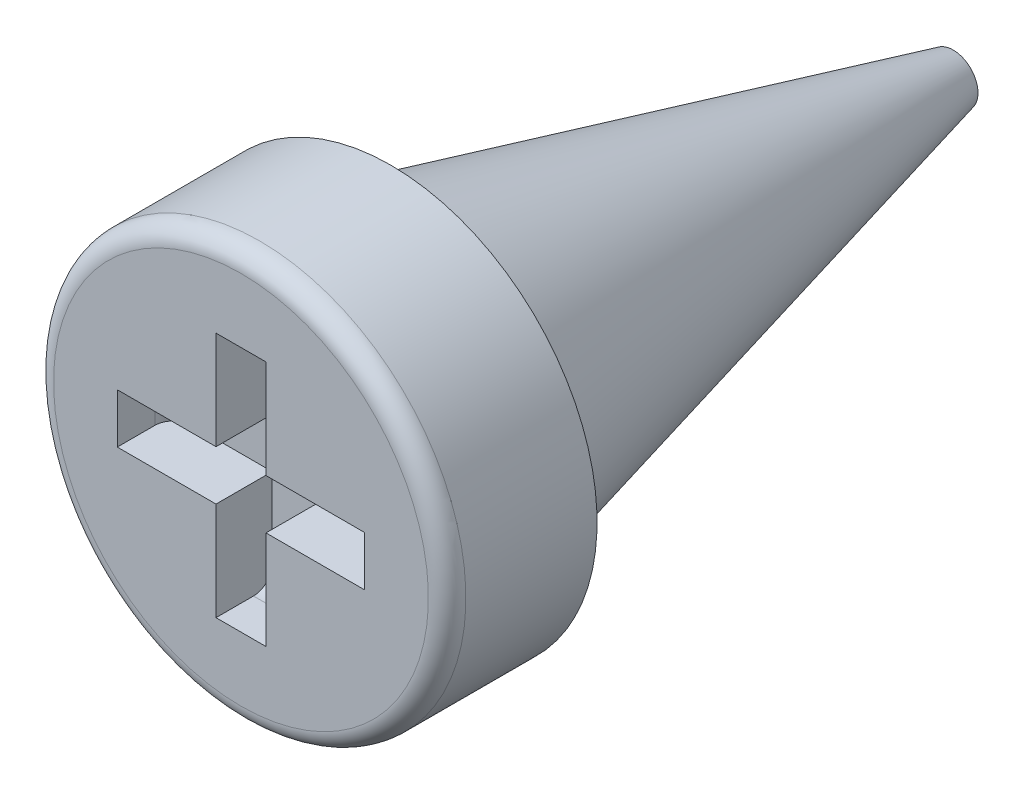
ISO-10303-21;
HEADER;
FILE_DESCRIPTION(('STEP AP214'),'2;1');
FILE_NAME('part.step','',(''),(''),'','','');
FILE_SCHEMA(('AUTOMOTIVE_DESIGN { 1 0 10303 214 1 1 1 1 }'));
ENDSEC;
DATA;
#1=APPLICATION_CONTEXT('core data for automotive mechanical design processes');
#2=APPLICATION_PROTOCOL_DEFINITION('international standard','automotive_design',2000,#1);
#3=PRODUCT_CONTEXT('',#1,'mechanical');
#4=PRODUCT('Part','Part','',(#3));
#5=PRODUCT_RELATED_PRODUCT_CATEGORY('part','',(#4));
#6=PRODUCT_DEFINITION_FORMATION('','',#4);
#7=PRODUCT_DEFINITION_CONTEXT('part definition',#1,'design');
#8=PRODUCT_DEFINITION('design','',#6,#7);
#9=PRODUCT_DEFINITION_SHAPE('','',#8);
#10=(LENGTH_UNIT() NAMED_UNIT(*) SI_UNIT(.MILLI.,.METRE.));
#11=(NAMED_UNIT(*) PLANE_ANGLE_UNIT() SI_UNIT($,.RADIAN.));
#12=(NAMED_UNIT(*) SI_UNIT($,.STERADIAN.) SOLID_ANGLE_UNIT());
#13=UNCERTAINTY_MEASURE_WITH_UNIT(LENGTH_MEASURE(1.E-05),#10,'distance_accuracy_value','');
#14=(GEOMETRIC_REPRESENTATION_CONTEXT(3) GLOBAL_UNCERTAINTY_ASSIGNED_CONTEXT((#13)) GLOBAL_UNIT_ASSIGNED_CONTEXT((#10,
#11,#12)) REPRESENTATION_CONTEXT('',''));
#15=CARTESIAN_POINT('',(0.,0.,0.));
#16=DIRECTION('',(0.,0.,1.));
#17=DIRECTION('',(1.,0.,0.));
#18=AXIS2_PLACEMENT_3D('',#15,#16,#17);
#19=CARTESIAN_POINT('',(0.,0.318,-9.12));
#20=DIRECTION('',(0.,0.,-1.));
#21=DIRECTION('',(0.,1.,0.));
#22=AXIS2_PLACEMENT_3D('',#19,#20,#21);
#23=PLANE('',#22);
#24=CARTESIAN_POINT('',(0.,0.,-9.12));
#25=DIRECTION('',(0.,0.,-1.));
#26=DIRECTION('',(0.,1.,0.));
#27=AXIS2_PLACEMENT_3D('',#24,#25,#26);
#28=CIRCLE('',#27,0.318);
#29=CARTESIAN_POINT('',(0.,-0.318,-9.12));
#30=VERTEX_POINT('',#29);
#31=EDGE_CURVE('E228',#30,#30,#28,.T.);
#32=ORIENTED_EDGE('',*,*,#31,.T.);
#33=EDGE_LOOP('',(#32));
#34=FACE_BOUND('',#33,.T.);
#35=ADVANCED_FACE('F37',(#34),#23,.T.);
#36=CARTESIAN_POINT('',(0.,0.,0.));
#37=DIRECTION('',(0.,0.,1.));
#38=DIRECTION('',(0.,-1.,0.));
#39=AXIS2_PLACEMENT_3D('',#36,#37,#38);
#40=PLANE('',#39);
#41=DIRECTION('',(1.,0.,0.));
#42=VECTOR('',#41,1.);
#43=CARTESIAN_POINT('',(0.32,-0.318,0.));
#44=LINE('',#43,#42);
#45=CARTESIAN_POINT('',(0.32,-0.318,0.));
#46=VERTEX_POINT('',#45);
#47=CARTESIAN_POINT('',(1.584,-0.318,0.));
#48=VERTEX_POINT('',#47);
#49=EDGE_CURVE('E193',#46,#48,#44,.T.);
#50=ORIENTED_EDGE('',*,*,#49,.F.);
#51=DIRECTION('',(0.,1.,0.));
#52=VECTOR('',#51,1.);
#53=CARTESIAN_POINT('',(0.32,-1.578,0.));
#54=LINE('',#53,#52);
#55=CARTESIAN_POINT('',(0.32,-1.578,0.));
#56=VERTEX_POINT('',#55);
#57=EDGE_CURVE('E223',#56,#46,#54,.T.);
#58=ORIENTED_EDGE('',*,*,#57,.F.);
#59=DIRECTION('',(1.,0.,0.));
#60=VECTOR('',#59,1.);
#61=CARTESIAN_POINT('',(0.32,-1.578,0.));
#62=LINE('',#61,#60);
#63=CARTESIAN_POINT('',(-0.319999999999999,-1.578,0.));
#64=VERTEX_POINT('',#63);
#65=EDGE_CURVE('E220',#64,#56,#62,.T.);
#66=ORIENTED_EDGE('',*,*,#65,.F.);
#67=DIRECTION('',(0.,-1.,0.));
#68=VECTOR('',#67,1.);
#69=CARTESIAN_POINT('',(-0.319999999999999,-1.578,0.));
#70=LINE('',#69,#68);
#71=CARTESIAN_POINT('',(-0.32,-0.318,0.));
#72=VERTEX_POINT('',#71);
#73=EDGE_CURVE('E217',#72,#64,#70,.T.);
#74=ORIENTED_EDGE('',*,*,#73,.F.);
#75=DIRECTION('',(1.,0.,0.));
#76=VECTOR('',#75,1.);
#77=CARTESIAN_POINT('',(-0.32,-0.318,0.));
#78=LINE('',#77,#76);
#79=CARTESIAN_POINT('',(-1.584,-0.318,0.));
#80=VERTEX_POINT('',#79);
#81=EDGE_CURVE('E214',#80,#72,#78,.T.);
#82=ORIENTED_EDGE('',*,*,#81,.F.);
#83=DIRECTION('',(0.,-1.,0.));
#84=VECTOR('',#83,1.);
#85=CARTESIAN_POINT('',(-1.584,0.318,0.));
#86=LINE('',#85,#84);
#87=CARTESIAN_POINT('',(-1.584,0.318,0.));
#88=VERTEX_POINT('',#87);
#89=EDGE_CURVE('E211',#88,#80,#86,.T.);
#90=ORIENTED_EDGE('',*,*,#89,.F.);
#91=DIRECTION('',(-1.,0.,0.));
#92=VECTOR('',#91,1.);
#93=CARTESIAN_POINT('',(-0.32,0.318,0.));
#94=LINE('',#93,#92);
#95=CARTESIAN_POINT('',(-0.32,0.318,0.));
#96=VERTEX_POINT('',#95);
#97=EDGE_CURVE('E208',#96,#88,#94,.T.);
#98=ORIENTED_EDGE('',*,*,#97,.F.);
#99=DIRECTION('',(0.,-1.,0.));
#100=VECTOR('',#99,1.);
#101=CARTESIAN_POINT('',(-0.32,1.578,0.));
#102=LINE('',#101,#100);
#103=CARTESIAN_POINT('',(-0.32,1.578,0.));
#104=VERTEX_POINT('',#103);
#105=EDGE_CURVE('E205',#104,#96,#102,.T.);
#106=ORIENTED_EDGE('',*,*,#105,.F.);
#107=DIRECTION('',(-1.,0.,0.));
#108=VECTOR('',#107,1.);
#109=CARTESIAN_POINT('',(0.32,1.578,0.));
#110=LINE('',#109,#108);
#111=CARTESIAN_POINT('',(0.32,1.578,0.));
#112=VERTEX_POINT('',#111);
#113=EDGE_CURVE('E202',#112,#104,#110,.T.);
#114=ORIENTED_EDGE('',*,*,#113,.F.);
#115=DIRECTION('',(0.,1.,0.));
#116=VECTOR('',#115,1.);
#117=CARTESIAN_POINT('',(0.32,1.578,0.));
#118=LINE('',#117,#116);
#119=CARTESIAN_POINT('',(0.32,0.318,0.));
#120=VERTEX_POINT('',#119);
#121=EDGE_CURVE('E200',#120,#112,#118,.T.);
#122=ORIENTED_EDGE('',*,*,#121,.F.);
#123=DIRECTION('',(-1.,0.,0.));
#124=VECTOR('',#123,1.);
#125=CARTESIAN_POINT('',(0.32,0.318,0.));
#126=LINE('',#125,#124);
#127=CARTESIAN_POINT('',(1.584,0.318,0.));
#128=VERTEX_POINT('',#127);
#129=EDGE_CURVE('E167',#128,#120,#126,.T.);
#130=ORIENTED_EDGE('',*,*,#129,.F.);
#131=DIRECTION('',(0.,1.,0.));
#132=VECTOR('',#131,1.);
#133=CARTESIAN_POINT('',(1.584,0.318,0.));
#134=LINE('',#133,#132);
#135=EDGE_CURVE('E196',#48,#128,#134,.T.);
#136=ORIENTED_EDGE('',*,*,#135,.F.);
#137=EDGE_LOOP('',(#50,#58,#66,#74,#82,#90,#98,#106,#114,#122,#130,#136));
#138=FACE_BOUND('',#137,.T.);
#139=CARTESIAN_POINT('',(0.,0.,0.));
#140=DIRECTION('',(0.,0.,-1.));
#141=DIRECTION('',(0.,1.,0.));
#142=AXIS2_PLACEMENT_3D('',#139,#140,#141);
#143=CIRCLE('',#142,2.4);
#144=CARTESIAN_POINT('',(0.,2.4,0.));
#145=VERTEX_POINT('',#144);
#146=EDGE_CURVE('E257',#145,#145,#143,.T.);
#147=ORIENTED_EDGE('',*,*,#146,.F.);
#148=EDGE_LOOP('',(#147));
#149=FACE_BOUND('',#148,.T.);
#150=ADVANCED_FACE('F311',(#138,#149),#40,.T.);
#151=CARTESIAN_POINT('',(0.,0.,-0.24));
#152=DIRECTION('',(0.,0.,-1.));
#153=DIRECTION('',(0.,1.,0.));
#154=AXIS2_PLACEMENT_3D('',#151,#152,#153);
#155=TOROIDAL_SURFACE('',#154,2.4,0.24);
#156=ORIENTED_EDGE('',*,*,#146,.T.);
#157=EDGE_LOOP('',(#156));
#158=FACE_BOUND('',#157,.T.);
#159=CARTESIAN_POINT('',(0.,0.,-0.240000000000001));
#160=DIRECTION('',(0.,0.,-1.));
#161=DIRECTION('',(0.,1.,0.));
#162=AXIS2_PLACEMENT_3D('',#159,#160,#161);
#163=CIRCLE('',#162,2.64);
#164=CARTESIAN_POINT('',(0.,2.64,-0.240000000000001));
#165=VERTEX_POINT('',#164);
#166=EDGE_CURVE('E254',#165,#165,#163,.T.);
#167=ORIENTED_EDGE('',*,*,#166,.F.);
#168=EDGE_LOOP('',(#167));
#169=FACE_BOUND('',#168,.T.);
#170=ADVANCED_FACE('F317',(#158,#169),#155,.T.);
#171=CARTESIAN_POINT('',(0.,0.,-9.12));
#172=DIRECTION('',(0.,0.,-1.));
#173=DIRECTION('',(0.,1.,0.));
#174=AXIS2_PLACEMENT_3D('',#171,#172,#173);
#175=CYLINDRICAL_SURFACE('',#174,2.64);
#176=ORIENTED_EDGE('',*,*,#166,.T.);
#177=EDGE_LOOP('',(#176));
#178=FACE_BOUND('',#177,.T.);
#179=CARTESIAN_POINT('',(0.,0.,-1.92));
#180=DIRECTION('',(0.,0.,-1.));
#181=DIRECTION('',(0.,1.,0.));
#182=AXIS2_PLACEMENT_3D('',#179,#180,#181);
#183=CIRCLE('',#182,2.64);
#184=CARTESIAN_POINT('',(0.,2.64,-1.92));
#185=VERTEX_POINT('',#184);
#186=EDGE_CURVE('E251',#185,#185,#183,.T.);
#187=ORIENTED_EDGE('',*,*,#186,.F.);
#188=EDGE_LOOP('',(#187));
#189=FACE_BOUND('',#188,.T.);
#190=ADVANCED_FACE('F367',(#178,#189),#175,.T.);
#191=CARTESIAN_POINT('',(0.,2.64,-1.92));
#192=DIRECTION('',(0.,0.,-1.));
#193=DIRECTION('',(0.,1.,0.));
#194=AXIS2_PLACEMENT_3D('',#191,#192,#193);
#195=PLANE('',#194);
#196=ORIENTED_EDGE('',*,*,#186,.T.);
#197=EDGE_LOOP('',(#196));
#198=FACE_BOUND('',#197,.T.);
#199=CARTESIAN_POINT('',(0.,0.,-1.92));
#200=DIRECTION('',(0.,0.,-1.));
#201=DIRECTION('',(0.,1.,0.));
#202=AXIS2_PLACEMENT_3D('',#199,#200,#201);
#203=CIRCLE('',#202,2.1131616204709);
#204=CARTESIAN_POINT('',(0.,-2.1131616204709,-1.92));
#205=VERTEX_POINT('',#204);
#206=EDGE_CURVE('E248',#205,#205,#203,.T.);
#207=ORIENTED_EDGE('',*,*,#206,.F.);
#208=EDGE_LOOP('',(#207));
#209=FACE_BOUND('',#208,.T.);
#210=ADVANCED_FACE('F363',(#198,#209),#195,.T.);
#211=CARTESIAN_POINT('',(0.,0.,-9.12));
#212=DIRECTION('',(0.,0.,1.));
#213=DIRECTION('',(0.,-1.,0.));
#214=AXIS2_PLACEMENT_3D('',#211,#212,#213);
#215=CONICAL_SURFACE('',#214,0.318,0.244346095279207);
#216=CARTESIAN_POINT('',(0.,-2.1131616204709,-1.92));
#217=CARTESIAN_POINT('',(0.,-2.09446202025767,-1.995));
#218=CARTESIAN_POINT('',(0.,-2.07576242004443,-2.07));
#219=CARTESIAN_POINT('',(0.,-2.03836321961795,-2.22));
#220=CARTESIAN_POINT('',(0.,-2.01966361940471,-2.295));
#221=CARTESIAN_POINT('',(0.,-1.98226441897824,-2.445));
#222=CARTESIAN_POINT('',(0.,-1.963564818765,-2.52));
#223=CARTESIAN_POINT('',(0.,-1.92616561833852,-2.67));
#224=CARTESIAN_POINT('',(0.,-1.90746601812528,-2.745));
#225=CARTESIAN_POINT('',(0.,-1.8700668176988,-2.895));
#226=CARTESIAN_POINT('',(0.,-1.85136721748556,-2.97));
#227=CARTESIAN_POINT('',(0.,-1.81396801705909,-3.12));
#228=CARTESIAN_POINT('',(0.,-1.79526841684585,-3.195));
#229=CARTESIAN_POINT('',(0.,-1.75786921641937,-3.345));
#230=CARTESIAN_POINT('',(0.,-1.73916961620613,-3.42));
#231=CARTESIAN_POINT('',(0.,-1.70177041577966,-3.57));
#232=CARTESIAN_POINT('',(0.,-1.68307081556642,-3.645));
#233=CARTESIAN_POINT('',(0.,-1.64567161513994,-3.795));
#234=CARTESIAN_POINT('',(0.,-1.6269720149267,-3.87));
#235=CARTESIAN_POINT('',(0.,-1.58957281450022,-4.02));
#236=CARTESIAN_POINT('',(0.,-1.57087321428699,-4.095));
#237=CARTESIAN_POINT('',(0.,-1.53347401386051,-4.245));
#238=CARTESIAN_POINT('',(0.,-1.51477441364727,-4.32));
#239=CARTESIAN_POINT('',(0.,-1.47737521322079,-4.47));
#240=CARTESIAN_POINT('',(0.,-1.45867561300755,-4.545));
#241=CARTESIAN_POINT('',(0.,-1.42127641258108,-4.695));
#242=CARTESIAN_POINT('',(0.,-1.40257681236784,-4.77));
#243=CARTESIAN_POINT('',(0.,-1.36517761194136,-4.92));
#244=CARTESIAN_POINT('',(0.,-1.34647801172812,-4.995));
#245=CARTESIAN_POINT('',(0.,-1.30907881130165,-5.145));
#246=CARTESIAN_POINT('',(0.,-1.29037921108841,-5.22));
#247=CARTESIAN_POINT('',(0.,-1.25298001066193,-5.37));
#248=CARTESIAN_POINT('',(0.,-1.23428041044869,-5.445));
#249=CARTESIAN_POINT('',(0.,-1.19688121002221,-5.595));
#250=CARTESIAN_POINT('',(0.,-1.17818160980898,-5.67));
#251=CARTESIAN_POINT('',(0.,-1.1407824093825,-5.82));
#252=CARTESIAN_POINT('',(0.,-1.12208280916926,-5.895));
#253=CARTESIAN_POINT('',(0.,-1.08468360874278,-6.045));
#254=CARTESIAN_POINT('',(0.,-1.06598400852954,-6.12));
#255=CARTESIAN_POINT('',(0.,-1.02858480810307,-6.27));
#256=CARTESIAN_POINT('',(0.,-1.00988520788983,-6.345));
#257=CARTESIAN_POINT('',(0.,-0.972486007463351,-6.495));
#258=CARTESIAN_POINT('',(0.,-0.953786407250112,-6.57));
#259=CARTESIAN_POINT('',(0.,-0.916387206823635,-6.72));
#260=CARTESIAN_POINT('',(0.,-0.897687606610397,-6.795));
#261=CARTESIAN_POINT('',(0.,-0.860288406183919,-6.945));
#262=CARTESIAN_POINT('',(0.,-0.841588805970681,-7.02));
#263=CARTESIAN_POINT('',(0.,-0.804189605544204,-7.17));
#264=CARTESIAN_POINT('',(0.,-0.785490005330965,-7.245));
#265=CARTESIAN_POINT('',(0.,-0.748090804904488,-7.395));
#266=CARTESIAN_POINT('',(0.,-0.729391204691249,-7.47));
#267=CARTESIAN_POINT('',(0.,-0.691992004264772,-7.62));
#268=CARTESIAN_POINT('',(0.,-0.673292404051533,-7.695));
#269=CARTESIAN_POINT('',(0.,-0.635893203625056,-7.845));
#270=CARTESIAN_POINT('',(0.,-0.617193603411818,-7.92));
#271=CARTESIAN_POINT('',(0.,-0.579794402985341,-8.07));
#272=CARTESIAN_POINT('',(0.,-0.561094802772102,-8.145));
#273=CARTESIAN_POINT('',(0.,-0.523695602345625,-8.295));
#274=CARTESIAN_POINT('',(0.,-0.504996002132386,-8.37));
#275=CARTESIAN_POINT('',(0.,-0.467596801705909,-8.52));
#276=CARTESIAN_POINT('',(0.,-0.44889720149267,-8.595));
#277=CARTESIAN_POINT('',(0.,-0.411498001066193,-8.745));
#278=CARTESIAN_POINT('',(0.,-0.392798400852955,-8.82));
#279=CARTESIAN_POINT('',(0.,-0.355399200426477,-8.97));
#280=CARTESIAN_POINT('',(0.,-0.336699600213239,-9.045));
#281=CARTESIAN_POINT('',(0.,-0.318,-9.12));
#282=B_SPLINE_CURVE_WITH_KNOTS('',3,(#216,#217,#218,#219,#220,#221,#222,#223,#224,#225,#226,
#227,#228,#229,#230,#231,#232,#233,#234,#235,#236,#237,#238,#239,#240,#241,#242,#243,#244,#245,
#246,#247,#248,#249,#250,#251,#252,#253,#254,#255,#256,#257,#258,#259,#260,#261,#262,#263,#264,
#265,#266,#267,#268,#269,#270,#271,#272,#273,#274,#275,#276,#277,#278,#279,#280,#281),
.UNSPECIFIED.,.F.,.F.,(4,2,2,2,2,2,2,2,2,2,2,2,2,2,2,2,2,2,2,2,2,2,2,2,2,2,2,2,2,2,2,2,4),(0.,
0.231888066603727,0.463776133207454,0.695664199811182,0.927552266414908,1.15944033301864,
1.39132839962236,1.62321646622609,1.85510453282982,2.08699259943354,2.31888066603727,
2.550768732641,2.78265679924472,3.01454486584845,3.24643293245218,3.4783209990559,
3.71020906565963,3.94209713226336,4.17398519886709,4.40587326547081,4.63776133207454,
4.86964939867827,5.10153746528199,5.33342553188572,5.56531359848945,5.79720166509317,
6.0290897316969,6.26097779830063,6.49286586490435,6.72475393150808,6.95664199811181,
7.18853006471554,7.42041813131926),.UNSPECIFIED.);
#283=EDGE_CURVE('BSEAM360',#205,#30,#282,.T.);
#284=ORIENTED_EDGE('',*,*,#206,.T.);
#285=ORIENTED_EDGE('',*,*,#31,.F.);
#286=ORIENTED_EDGE('',*,*,#283,.T.);
#287=ORIENTED_EDGE('',*,*,#283,.F.);
#288=EDGE_LOOP('',(#284,#286,#285,#287));
#289=FACE_BOUND('',#288,.T.);
#290=ADVANCED_FACE('F360',(#289),#215,.T.);
#291=CARTESIAN_POINT('',(0.32,-0.318,-0.72));
#292=DIRECTION('',(0.,-1.,0.));
#293=DIRECTION('',(1.,0.,0.));
#294=AXIS2_PLACEMENT_3D('',#291,#292,#293);
#295=PLANE('',#294);
#296=DIRECTION('',(0.,0.,1.));
#297=VECTOR('',#296,1.);
#298=CARTESIAN_POINT('',(1.584,-0.318,-0.72));
#299=LINE('',#298,#297);
#300=CARTESIAN_POINT('',(1.584,-0.318,-0.48));
#301=VERTEX_POINT('',#300);
#302=EDGE_CURVE('E192',#301,#48,#299,.T.);
#303=ORIENTED_EDGE('',*,*,#302,.F.);
#304=CARTESIAN_POINT('',(1.344,-0.318,-0.48));
#305=DIRECTION('',(0.,-1.,0.));
#306=DIRECTION('',(1.,0.,0.));
#307=AXIS2_PLACEMENT_3D('',#304,#305,#306);
#308=CIRCLE('',#307,0.24);
#309=CARTESIAN_POINT('',(1.344,-0.318,-0.72));
#310=VERTEX_POINT('',#309);
#311=EDGE_CURVE('E279',#301,#310,#308,.F.);
#312=ORIENTED_EDGE('',*,*,#311,.T.);
#313=DIRECTION('',(1.,0.,0.));
#314=VECTOR('',#313,1.);
#315=CARTESIAN_POINT('',(0.32,-0.318,-0.72));
#316=LINE('',#315,#314);
#317=CARTESIAN_POINT('',(0.32,-0.318,-0.72));
#318=VERTEX_POINT('',#317);
#319=EDGE_CURVE('E161',#318,#310,#316,.T.);
#320=ORIENTED_EDGE('',*,*,#319,.F.);
#321=DIRECTION('',(0.,0.,1.));
#322=VECTOR('',#321,1.);
#323=CARTESIAN_POINT('',(0.32,-0.318,-0.72));
#324=LINE('',#323,#322);
#325=EDGE_CURVE('E226',#318,#46,#324,.T.);
#326=ORIENTED_EDGE('',*,*,#325,.T.);
#327=ORIENTED_EDGE('',*,*,#49,.T.);
#328=EDGE_LOOP('',(#303,#312,#320,#326,#327));
#329=FACE_BOUND('',#328,.T.);
#330=ADVANCED_FACE('F335',(#329),#295,.F.);
#331=CARTESIAN_POINT('',(0.32,-1.578,-0.72));
#332=DIRECTION('',(1.,0.,0.));
#333=DIRECTION('',(0.,1.,0.));
#334=AXIS2_PLACEMENT_3D('',#331,#332,#333);
#335=PLANE('',#334);
#336=DIRECTION('',(0.,1.,0.));
#337=VECTOR('',#336,1.);
#338=CARTESIAN_POINT('',(0.32,-1.578,-0.72));
#339=LINE('',#338,#337);
#340=CARTESIAN_POINT('',(0.32,-1.338,-0.72));
#341=VERTEX_POINT('',#340);
#342=EDGE_CURVE('E190',#341,#318,#339,.T.);
#343=ORIENTED_EDGE('',*,*,#342,.F.);
#344=CARTESIAN_POINT('',(0.32,-1.338,-0.48));
#345=DIRECTION('',(1.,0.,0.));
#346=DIRECTION('',(0.,1.,0.));
#347=AXIS2_PLACEMENT_3D('',#344,#345,#346);
#348=CIRCLE('',#347,0.24);
#349=CARTESIAN_POINT('',(0.32,-1.578,-0.48));
#350=VERTEX_POINT('',#349);
#351=EDGE_CURVE('E269',#341,#350,#348,.F.);
#352=ORIENTED_EDGE('',*,*,#351,.T.);
#353=DIRECTION('',(0.,0.,1.));
#354=VECTOR('',#353,1.);
#355=CARTESIAN_POINT('',(0.32,-1.578,-0.72));
#356=LINE('',#355,#354);
#357=EDGE_CURVE('E229',#350,#56,#356,.T.);
#358=ORIENTED_EDGE('',*,*,#357,.T.);
#359=ORIENTED_EDGE('',*,*,#57,.T.);
#360=ORIENTED_EDGE('',*,*,#325,.F.);
#361=EDGE_LOOP('',(#343,#352,#358,#359,#360));
#362=FACE_BOUND('',#361,.T.);
#363=ADVANCED_FACE('F340',(#362),#335,.F.);
#364=CARTESIAN_POINT('',(0.32,-1.578,-0.72));
#365=DIRECTION('',(0.,-1.,0.));
#366=DIRECTION('',(0.,0.,-1.));
#367=AXIS2_PLACEMENT_3D('',#364,#365,#366);
#368=PLANE('',#367);
#369=ORIENTED_EDGE('',*,*,#357,.F.);
#370=DIRECTION('',(1.,0.,0.));
#371=VECTOR('',#370,1.);
#372=CARTESIAN_POINT('',(-0.319999999999999,-1.578,-0.48));
#373=LINE('',#372,#371);
#374=CARTESIAN_POINT('',(-0.319999999999999,-1.578,-0.48));
#375=VERTEX_POINT('',#374);
#376=EDGE_CURVE('E271',#350,#375,#373,.F.);
#377=ORIENTED_EDGE('',*,*,#376,.T.);
#378=DIRECTION('',(0.,0.,1.));
#379=VECTOR('',#378,1.);
#380=CARTESIAN_POINT('',(-0.319999999999999,-1.578,-0.72));
#381=LINE('',#380,#379);
#382=EDGE_CURVE('E231',#375,#64,#381,.T.);
#383=ORIENTED_EDGE('',*,*,#382,.T.);
#384=ORIENTED_EDGE('',*,*,#65,.T.);
#385=EDGE_LOOP('',(#369,#377,#383,#384));
#386=FACE_BOUND('',#385,.T.);
#387=ADVANCED_FACE('F408',(#386),#368,.F.);
#388=CARTESIAN_POINT('',(-0.319999999999999,-1.578,-0.72));
#389=DIRECTION('',(-1.,0.,0.));
#390=DIRECTION('',(0.,-1.,0.));
#391=AXIS2_PLACEMENT_3D('',#388,#389,#390);
#392=PLANE('',#391);
#393=ORIENTED_EDGE('',*,*,#382,.F.);
#394=CARTESIAN_POINT('',(-0.319999999999999,-1.338,-0.48));
#395=DIRECTION('',(-1.,0.,0.));
#396=DIRECTION('',(0.,-1.,0.));
#397=AXIS2_PLACEMENT_3D('',#394,#395,#396);
#398=CIRCLE('',#397,0.24);
#399=CARTESIAN_POINT('',(-0.319999999999999,-1.338,-0.72));
#400=VERTEX_POINT('',#399);
#401=EDGE_CURVE('E273',#375,#400,#398,.F.);
#402=ORIENTED_EDGE('',*,*,#401,.T.);
#403=DIRECTION('',(0.,-1.,0.));
#404=VECTOR('',#403,1.);
#405=CARTESIAN_POINT('',(-0.319999999999999,-1.578,-0.72));
#406=LINE('',#405,#404);
#407=CARTESIAN_POINT('',(-0.32,-0.318,-0.72));
#408=VERTEX_POINT('',#407);
#409=EDGE_CURVE('E188',#408,#400,#406,.T.);
#410=ORIENTED_EDGE('',*,*,#409,.F.);
#411=DIRECTION('',(0.,0.,1.));
#412=VECTOR('',#411,1.);
#413=CARTESIAN_POINT('',(-0.32,-0.318,-0.72));
#414=LINE('',#413,#412);
#415=EDGE_CURVE('E233',#408,#72,#414,.T.);
#416=ORIENTED_EDGE('',*,*,#415,.T.);
#417=ORIENTED_EDGE('',*,*,#73,.T.);
#418=EDGE_LOOP('',(#393,#402,#410,#416,#417));
#419=FACE_BOUND('',#418,.T.);
#420=ADVANCED_FACE('F415',(#419),#392,.F.);
#421=CARTESIAN_POINT('',(-0.32,-0.318,-0.72));
#422=DIRECTION('',(0.,-1.,0.));
#423=DIRECTION('',(1.,0.,0.));
#424=AXIS2_PLACEMENT_3D('',#421,#422,#423);
#425=PLANE('',#424);
#426=DIRECTION('',(1.,0.,0.));
#427=VECTOR('',#426,1.);
#428=CARTESIAN_POINT('',(-0.32,-0.318,-0.72));
#429=LINE('',#428,#427);
#430=CARTESIAN_POINT('',(-1.344,-0.318,-0.72));
#431=VERTEX_POINT('',#430);
#432=EDGE_CURVE('E186',#431,#408,#429,.T.);
#433=ORIENTED_EDGE('',*,*,#432,.F.);
#434=CARTESIAN_POINT('',(-1.344,-0.318,-0.48));
#435=DIRECTION('',(0.,-1.,0.));
#436=DIRECTION('',(1.,0.,0.));
#437=AXIS2_PLACEMENT_3D('',#434,#435,#436);
#438=CIRCLE('',#437,0.24);
#439=CARTESIAN_POINT('',(-1.584,-0.318,-0.48));
#440=VERTEX_POINT('',#439);
#441=EDGE_CURVE('E59',#431,#440,#438,.F.);
#442=ORIENTED_EDGE('',*,*,#441,.T.);
#443=DIRECTION('',(0.,0.,1.));
#444=VECTOR('',#443,1.);
#445=CARTESIAN_POINT('',(-1.584,-0.318,-0.72));
#446=LINE('',#445,#444);
#447=EDGE_CURVE('E235',#440,#80,#446,.T.);
#448=ORIENTED_EDGE('',*,*,#447,.T.);
#449=ORIENTED_EDGE('',*,*,#81,.T.);
#450=ORIENTED_EDGE('',*,*,#415,.F.);
#451=EDGE_LOOP('',(#433,#442,#448,#449,#450));
#452=FACE_BOUND('',#451,.T.);
#453=ADVANCED_FACE('F423',(#452),#425,.F.);
#454=CARTESIAN_POINT('',(-1.584,0.318,-0.72));
#455=DIRECTION('',(-1.,0.,0.));
#456=DIRECTION('',(0.,0.,1.));
#457=AXIS2_PLACEMENT_3D('',#454,#455,#456);
#458=PLANE('',#457);
#459=ORIENTED_EDGE('',*,*,#447,.F.);
#460=DIRECTION('',(0.,-1.,0.));
#461=VECTOR('',#460,1.);
#462=CARTESIAN_POINT('',(-1.584,0.318,-0.48));
#463=LINE('',#462,#461);
#464=CARTESIAN_POINT('',(-1.584,0.318,-0.48));
#465=VERTEX_POINT('',#464);
#466=EDGE_CURVE('E45',#440,#465,#463,.F.);
#467=ORIENTED_EDGE('',*,*,#466,.T.);
#468=DIRECTION('',(0.,0.,1.));
#469=VECTOR('',#468,1.);
#470=CARTESIAN_POINT('',(-1.584,0.318,-0.72));
#471=LINE('',#470,#469);
#472=EDGE_CURVE('E237',#465,#88,#471,.T.);
#473=ORIENTED_EDGE('',*,*,#472,.T.);
#474=ORIENTED_EDGE('',*,*,#89,.T.);
#475=EDGE_LOOP('',(#459,#467,#473,#474));
#476=FACE_BOUND('',#475,.T.);
#477=ADVANCED_FACE('F431',(#476),#458,.F.);
#478=CARTESIAN_POINT('',(-0.32,0.318,-0.72));
#479=DIRECTION('',(0.,1.,0.));
#480=DIRECTION('',(-1.,0.,0.));
#481=AXIS2_PLACEMENT_3D('',#478,#479,#480);
#482=PLANE('',#481);
#483=ORIENTED_EDGE('',*,*,#472,.F.);
#484=CARTESIAN_POINT('',(-1.344,0.318,-0.48));
#485=DIRECTION('',(0.,1.,0.));
#486=DIRECTION('',(-1.,0.,0.));
#487=AXIS2_PLACEMENT_3D('',#484,#485,#486);
#488=CIRCLE('',#487,0.24);
#489=CARTESIAN_POINT('',(-1.344,0.318,-0.72));
#490=VERTEX_POINT('',#489);
#491=EDGE_CURVE('E11',#465,#490,#488,.F.);
#492=ORIENTED_EDGE('',*,*,#491,.T.);
#493=DIRECTION('',(-1.,0.,0.));
#494=VECTOR('',#493,1.);
#495=CARTESIAN_POINT('',(-0.32,0.318,-0.72));
#496=LINE('',#495,#494);
#497=CARTESIAN_POINT('',(-0.32,0.318,-0.72));
#498=VERTEX_POINT('',#497);
#499=EDGE_CURVE('E180',#498,#490,#496,.T.);
#500=ORIENTED_EDGE('',*,*,#499,.F.);
#501=DIRECTION('',(0.,0.,1.));
#502=VECTOR('',#501,1.);
#503=CARTESIAN_POINT('',(-0.32,0.318,-0.72));
#504=LINE('',#503,#502);
#505=EDGE_CURVE('E239',#498,#96,#504,.T.);
#506=ORIENTED_EDGE('',*,*,#505,.T.);
#507=ORIENTED_EDGE('',*,*,#97,.T.);
#508=EDGE_LOOP('',(#483,#492,#500,#506,#507));
#509=FACE_BOUND('',#508,.T.);
#510=ADVANCED_FACE('F301',(#509),#482,.F.);
#511=CARTESIAN_POINT('',(-0.32,1.578,-0.72));
#512=DIRECTION('',(-1.,0.,0.));
#513=DIRECTION('',(0.,-1.,0.));
#514=AXIS2_PLACEMENT_3D('',#511,#512,#513);
#515=PLANE('',#514);
#516=DIRECTION('',(0.,-1.,0.));
#517=VECTOR('',#516,1.);
#518=CARTESIAN_POINT('',(-0.32,1.578,-0.72));
#519=LINE('',#518,#517);
#520=CARTESIAN_POINT('',(-0.32,1.338,-0.72));
#521=VERTEX_POINT('',#520);
#522=EDGE_CURVE('E178',#521,#498,#519,.T.);
#523=ORIENTED_EDGE('',*,*,#522,.F.);
#524=CARTESIAN_POINT('',(-0.32,1.338,-0.48));
#525=DIRECTION('',(-1.,0.,0.));
#526=DIRECTION('',(0.,-1.,0.));
#527=AXIS2_PLACEMENT_3D('',#524,#525,#526);
#528=CIRCLE('',#527,0.24);
#529=CARTESIAN_POINT('',(-0.32,1.578,-0.48));
#530=VERTEX_POINT('',#529);
#531=EDGE_CURVE('E281',#521,#530,#528,.F.);
#532=ORIENTED_EDGE('',*,*,#531,.T.);
#533=DIRECTION('',(0.,0.,1.));
#534=VECTOR('',#533,1.);
#535=CARTESIAN_POINT('',(-0.32,1.578,-0.72));
#536=LINE('',#535,#534);
#537=EDGE_CURVE('E241',#530,#104,#536,.T.);
#538=ORIENTED_EDGE('',*,*,#537,.T.);
#539=ORIENTED_EDGE('',*,*,#105,.T.);
#540=ORIENTED_EDGE('',*,*,#505,.F.);
#541=EDGE_LOOP('',(#523,#532,#538,#539,#540));
#542=FACE_BOUND('',#541,.T.);
#543=ADVANCED_FACE('F296',(#542),#515,.F.);
#544=CARTESIAN_POINT('',(0.32,1.578,-0.72));
#545=DIRECTION('',(0.,1.,0.));
#546=DIRECTION('',(0.,0.,1.));
#547=AXIS2_PLACEMENT_3D('',#544,#545,#546);
#548=PLANE('',#547);
#549=ORIENTED_EDGE('',*,*,#537,.F.);
#550=DIRECTION('',(-1.,0.,0.));
#551=VECTOR('',#550,1.);
#552=CARTESIAN_POINT('',(0.32,1.578,-0.48));
#553=LINE('',#552,#551);
#554=CARTESIAN_POINT('',(0.32,1.578,-0.48));
#555=VERTEX_POINT('',#554);
#556=EDGE_CURVE('E283',#530,#555,#553,.F.);
#557=ORIENTED_EDGE('',*,*,#556,.T.);
#558=DIRECTION('',(0.,0.,1.));
#559=VECTOR('',#558,1.);
#560=CARTESIAN_POINT('',(0.32,1.578,-0.72));
#561=LINE('',#560,#559);
#562=EDGE_CURVE('E171',#555,#112,#561,.T.);
#563=ORIENTED_EDGE('',*,*,#562,.T.);
#564=ORIENTED_EDGE('',*,*,#113,.T.);
#565=EDGE_LOOP('',(#549,#557,#563,#564));
#566=FACE_BOUND('',#565,.T.);
#567=ADVANCED_FACE('F289',(#566),#548,.F.);
#568=CARTESIAN_POINT('',(0.32,1.578,-0.72));
#569=DIRECTION('',(1.,0.,0.));
#570=DIRECTION('',(0.,1.,0.));
#571=AXIS2_PLACEMENT_3D('',#568,#569,#570);
#572=PLANE('',#571);
#573=ORIENTED_EDGE('',*,*,#562,.F.);
#574=CARTESIAN_POINT('',(0.32,1.338,-0.48));
#575=DIRECTION('',(1.,0.,0.));
#576=DIRECTION('',(0.,1.,0.));
#577=AXIS2_PLACEMENT_3D('',#574,#575,#576);
#578=CIRCLE('',#577,0.24);
#579=CARTESIAN_POINT('',(0.32,1.338,-0.72));
#580=VERTEX_POINT('',#579);
#581=EDGE_CURVE('E177',#555,#580,#578,.F.);
#582=ORIENTED_EDGE('',*,*,#581,.T.);
#583=DIRECTION('',(0.,1.,0.));
#584=VECTOR('',#583,1.);
#585=CARTESIAN_POINT('',(0.32,1.578,-0.72));
#586=LINE('',#585,#584);
#587=CARTESIAN_POINT('',(0.32,0.318,-0.72));
#588=VERTEX_POINT('',#587);
#589=EDGE_CURVE('E155',#588,#580,#586,.T.);
#590=ORIENTED_EDGE('',*,*,#589,.F.);
#591=DIRECTION('',(0.,0.,1.));
#592=VECTOR('',#591,1.);
#593=CARTESIAN_POINT('',(0.32,0.318,-0.72));
#594=LINE('',#593,#592);
#595=EDGE_CURVE('E164',#588,#120,#594,.T.);
#596=ORIENTED_EDGE('',*,*,#595,.T.);
#597=ORIENTED_EDGE('',*,*,#121,.T.);
#598=EDGE_LOOP('',(#573,#582,#590,#596,#597));
#599=FACE_BOUND('',#598,.T.);
#600=ADVANCED_FACE('F175',(#599),#572,.F.);
#601=CARTESIAN_POINT('',(0.32,0.318,-0.72));
#602=DIRECTION('',(0.,1.,0.));
#603=DIRECTION('',(-1.,0.,0.));
#604=AXIS2_PLACEMENT_3D('',#601,#602,#603);
#605=PLANE('',#604);
#606=DIRECTION('',(-1.,0.,0.));
#607=VECTOR('',#606,1.);
#608=CARTESIAN_POINT('',(0.32,0.318,-0.72));
#609=LINE('',#608,#607);
#610=CARTESIAN_POINT('',(1.344,0.318,-0.72));
#611=VERTEX_POINT('',#610);
#612=EDGE_CURVE('E149',#611,#588,#609,.T.);
#613=ORIENTED_EDGE('',*,*,#612,.F.);
#614=CARTESIAN_POINT('',(1.344,0.318,-0.48));
#615=DIRECTION('',(0.,1.,0.));
#616=DIRECTION('',(-1.,0.,0.));
#617=AXIS2_PLACEMENT_3D('',#614,#615,#616);
#618=CIRCLE('',#617,0.24);
#619=CARTESIAN_POINT('',(1.584,0.318,-0.48));
#620=VERTEX_POINT('',#619);
#621=EDGE_CURVE('E275',#611,#620,#618,.F.);
#622=ORIENTED_EDGE('',*,*,#621,.T.);
#623=DIRECTION('',(0.,0.,1.));
#624=VECTOR('',#623,1.);
#625=CARTESIAN_POINT('',(1.584,0.318,-0.72));
#626=LINE('',#625,#624);
#627=EDGE_CURVE('E172',#620,#128,#626,.T.);
#628=ORIENTED_EDGE('',*,*,#627,.T.);
#629=ORIENTED_EDGE('',*,*,#129,.T.);
#630=ORIENTED_EDGE('',*,*,#595,.F.);
#631=EDGE_LOOP('',(#613,#622,#628,#629,#630));
#632=FACE_BOUND('',#631,.T.);
#633=ADVANCED_FACE('F165',(#632),#605,.F.);
#634=CARTESIAN_POINT('',(1.584,0.318,-0.72));
#635=DIRECTION('',(1.,0.,0.));
#636=DIRECTION('',(0.,0.,-1.));
#637=AXIS2_PLACEMENT_3D('',#634,#635,#636);
#638=PLANE('',#637);
#639=ORIENTED_EDGE('',*,*,#627,.F.);
#640=DIRECTION('',(0.,1.,0.));
#641=VECTOR('',#640,1.);
#642=CARTESIAN_POINT('',(1.584,-0.318,-0.48));
#643=LINE('',#642,#641);
#644=EDGE_CURVE('E277',#620,#301,#643,.F.);
#645=ORIENTED_EDGE('',*,*,#644,.T.);
#646=ORIENTED_EDGE('',*,*,#302,.T.);
#647=ORIENTED_EDGE('',*,*,#135,.T.);
#648=EDGE_LOOP('',(#639,#645,#646,#647));
#649=FACE_BOUND('',#648,.T.);
#650=ADVANCED_FACE('F347',(#649),#638,.F.);
#651=CARTESIAN_POINT('',(0.,0.,-0.72));
#652=DIRECTION('',(0.,0.,-1.));
#653=DIRECTION('',(-1.,0.,0.));
#654=AXIS2_PLACEMENT_3D('',#651,#652,#653);
#655=PLANE('',#654);
#656=ORIENTED_EDGE('',*,*,#409,.T.);
#657=DIRECTION('',(1.,0.,0.));
#658=VECTOR('',#657,1.);
#659=CARTESIAN_POINT('',(0.32,-1.338,-0.72));
#660=LINE('',#659,#658);
#661=EDGE_CURVE('E266',#400,#341,#660,.T.);
#662=ORIENTED_EDGE('',*,*,#661,.T.);
#663=ORIENTED_EDGE('',*,*,#342,.T.);
#664=ORIENTED_EDGE('',*,*,#319,.T.);
#665=DIRECTION('',(0.,1.,0.));
#666=VECTOR('',#665,1.);
#667=CARTESIAN_POINT('',(1.344,0.318,-0.72));
#668=LINE('',#667,#666);
#669=EDGE_CURVE('E159',#310,#611,#668,.T.);
#670=ORIENTED_EDGE('',*,*,#669,.T.);
#671=ORIENTED_EDGE('',*,*,#612,.T.);
#672=ORIENTED_EDGE('',*,*,#589,.T.);
#673=DIRECTION('',(-1.,0.,0.));
#674=VECTOR('',#673,1.);
#675=CARTESIAN_POINT('',(-0.32,1.338,-0.72));
#676=LINE('',#675,#674);
#677=EDGE_CURVE('E263',#580,#521,#676,.T.);
#678=ORIENTED_EDGE('',*,*,#677,.T.);
#679=ORIENTED_EDGE('',*,*,#522,.T.);
#680=ORIENTED_EDGE('',*,*,#499,.T.);
#681=DIRECTION('',(0.,-1.,0.));
#682=VECTOR('',#681,1.);
#683=CARTESIAN_POINT('',(-1.344,-0.318,-0.72));
#684=LINE('',#683,#682);
#685=EDGE_CURVE('E260',#490,#431,#684,.T.);
#686=ORIENTED_EDGE('',*,*,#685,.T.);
#687=ORIENTED_EDGE('',*,*,#432,.T.);
#688=EDGE_LOOP('',(#656,#662,#663,#664,#670,#671,#672,#678,#679,#680,#686,#687));
#689=FACE_BOUND('',#688,.T.);
#690=ADVANCED_FACE('F152',(#689),#655,.F.);
#691=CARTESIAN_POINT('',(0.,-1.338,-0.48));
#692=DIRECTION('',(-1.,0.,0.));
#693=DIRECTION('',(0.,0.,1.));
#694=AXIS2_PLACEMENT_3D('',#691,#692,#693);
#695=CYLINDRICAL_SURFACE('',#694,0.24);
#696=ORIENTED_EDGE('',*,*,#401,.F.);
#697=ORIENTED_EDGE('',*,*,#376,.F.);
#698=ORIENTED_EDGE('',*,*,#351,.F.);
#699=ORIENTED_EDGE('',*,*,#661,.F.);
#700=EDGE_LOOP('',(#696,#697,#698,#699));
#701=FACE_BOUND('',#700,.T.);
#702=ADVANCED_FACE('F322',(#701),#695,.F.);
#703=CARTESIAN_POINT('',(1.344,0.,-0.48));
#704=DIRECTION('',(0.,-1.,0.));
#705=DIRECTION('',(0.,0.,-1.));
#706=AXIS2_PLACEMENT_3D('',#703,#704,#705);
#707=CYLINDRICAL_SURFACE('',#706,0.24);
#708=ORIENTED_EDGE('',*,*,#311,.F.);
#709=ORIENTED_EDGE('',*,*,#644,.F.);
#710=ORIENTED_EDGE('',*,*,#621,.F.);
#711=ORIENTED_EDGE('',*,*,#669,.F.);
#712=EDGE_LOOP('',(#708,#709,#710,#711));
#713=FACE_BOUND('',#712,.T.);
#714=ADVANCED_FACE('F309',(#713),#707,.F.);
#715=CARTESIAN_POINT('',(0.,1.338,-0.48));
#716=DIRECTION('',(1.,0.,0.));
#717=DIRECTION('',(0.,0.,-1.));
#718=AXIS2_PLACEMENT_3D('',#715,#716,#717);
#719=CYLINDRICAL_SURFACE('',#718,0.24);
#720=ORIENTED_EDGE('',*,*,#581,.F.);
#721=ORIENTED_EDGE('',*,*,#556,.F.);
#722=ORIENTED_EDGE('',*,*,#531,.F.);
#723=ORIENTED_EDGE('',*,*,#677,.F.);
#724=EDGE_LOOP('',(#720,#721,#722,#723));
#725=FACE_BOUND('',#724,.T.);
#726=ADVANCED_FACE('F292',(#725),#719,.F.);
#727=CARTESIAN_POINT('',(-1.344,0.,-0.48));
#728=DIRECTION('',(0.,1.,0.));
#729=DIRECTION('',(0.,0.,1.));
#730=AXIS2_PLACEMENT_3D('',#727,#728,#729);
#731=CYLINDRICAL_SURFACE('',#730,0.24);
#732=ORIENTED_EDGE('',*,*,#491,.F.);
#733=ORIENTED_EDGE('',*,*,#466,.F.);
#734=ORIENTED_EDGE('',*,*,#441,.F.);
#735=ORIENTED_EDGE('',*,*,#685,.F.);
#736=EDGE_LOOP('',(#732,#733,#734,#735));
#737=FACE_BOUND('',#736,.T.);
#738=ADVANCED_FACE('F39',(#737),#731,.F.);
#739=CLOSED_SHELL('',(#35,#150,#170,#190,#210,#290,#330,#363,#387,#420,#453,#477,#510,#543,#567,
#600,#633,#650,#690,#702,#714,#726,#738));
#740=MANIFOLD_SOLID_BREP('B2',#739);
#741=ADVANCED_BREP_SHAPE_REPRESENTATION('',(#18,#740),#14);
#742=SHAPE_DEFINITION_REPRESENTATION(#9,#741);
ENDSEC;
END-ISO-10303-21;
